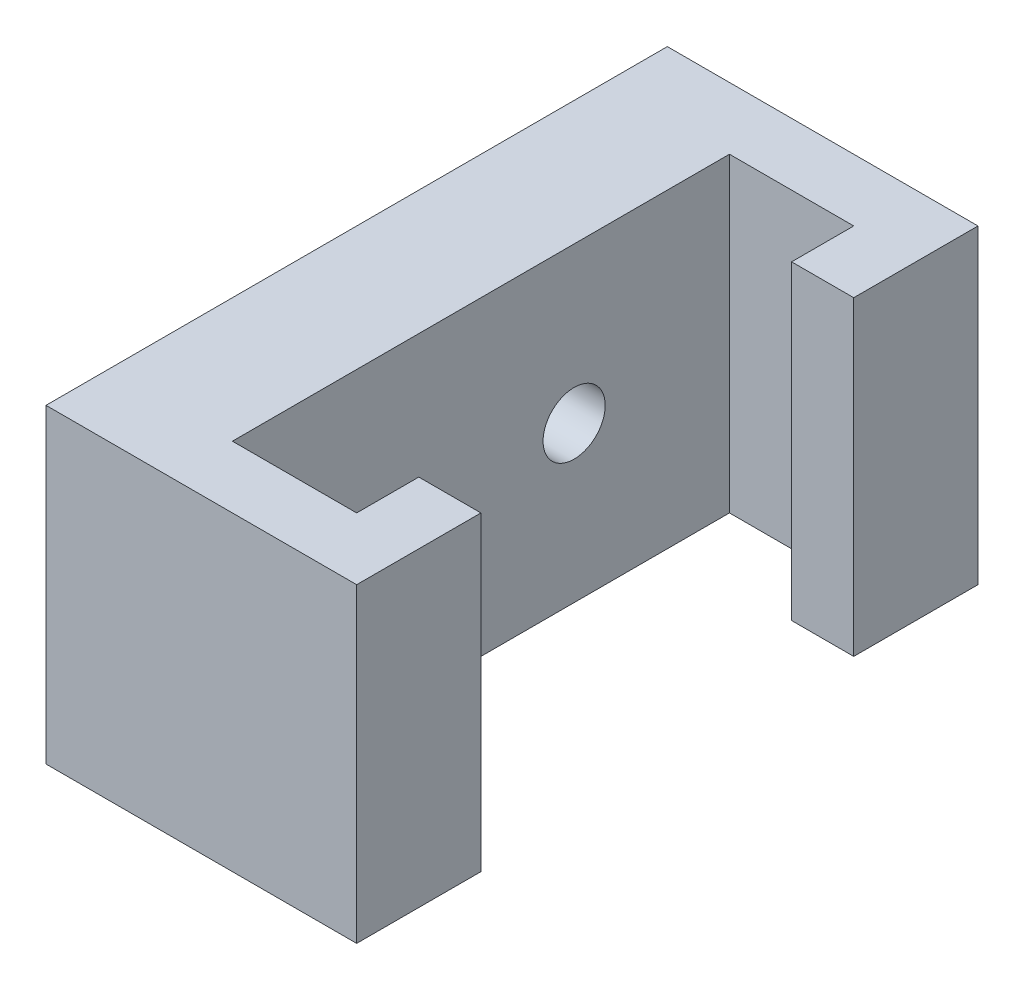
ISO-10303-21;
HEADER;
FILE_DESCRIPTION(('STEP AP214'),'2;1');
FILE_NAME('part.step','',(''),(''),'','','');
FILE_SCHEMA(('AUTOMOTIVE_DESIGN { 1 0 10303 214 1 1 1 1 }'));
ENDSEC;
DATA;
#1=APPLICATION_CONTEXT('core data for automotive mechanical design processes');
#2=APPLICATION_PROTOCOL_DEFINITION('international standard','automotive_design',2000,#1);
#3=PRODUCT_CONTEXT('',#1,'mechanical');
#4=PRODUCT('Part','Part','',(#3));
#5=PRODUCT_RELATED_PRODUCT_CATEGORY('part','',(#4));
#6=PRODUCT_DEFINITION_FORMATION('','',#4);
#7=PRODUCT_DEFINITION_CONTEXT('part definition',#1,'design');
#8=PRODUCT_DEFINITION('design','',#6,#7);
#9=PRODUCT_DEFINITION_SHAPE('','',#8);
#10=(LENGTH_UNIT() NAMED_UNIT(*) SI_UNIT(.MILLI.,.METRE.));
#11=(NAMED_UNIT(*) PLANE_ANGLE_UNIT() SI_UNIT($,.RADIAN.));
#12=(NAMED_UNIT(*) SI_UNIT($,.STERADIAN.) SOLID_ANGLE_UNIT());
#13=UNCERTAINTY_MEASURE_WITH_UNIT(LENGTH_MEASURE(1.E-05),#10,'distance_accuracy_value','');
#14=(GEOMETRIC_REPRESENTATION_CONTEXT(3) GLOBAL_UNCERTAINTY_ASSIGNED_CONTEXT((#13)) GLOBAL_UNIT_ASSIGNED_CONTEXT((#10,
#11,#12)) REPRESENTATION_CONTEXT('',''));
#15=CARTESIAN_POINT('',(0.,0.,0.));
#16=DIRECTION('',(0.,0.,1.));
#17=DIRECTION('',(1.,0.,0.));
#18=AXIS2_PLACEMENT_3D('',#15,#16,#17);
#19=CARTESIAN_POINT('',(150.,35.,0.));
#20=DIRECTION('',(1.,0.,0.));
#21=DIRECTION('',(0.,0.,-1.));
#22=AXIS2_PLACEMENT_3D('',#19,#20,#21);
#23=PLANE('',#22);
#24=DIRECTION('',(0.,0.,-1.));
#25=VECTOR('',#24,1.);
#26=CARTESIAN_POINT('',(150.,60.,0.));
#27=LINE('',#26,#25);
#28=CARTESIAN_POINT('',(150.,60.,9.99999999999999));
#29=VERTEX_POINT('',#28);
#30=CARTESIAN_POINT('',(150.,60.,0.));
#31=VERTEX_POINT('',#30);
#32=EDGE_CURVE('E165',#29,#31,#27,.T.);
#33=ORIENTED_EDGE('',*,*,#32,.F.);
#34=DIRECTION('',(0.,1.,0.));
#35=VECTOR('',#34,1.);
#36=CARTESIAN_POINT('',(150.,35.,9.99999999999999));
#37=LINE('',#36,#35);
#38=CARTESIAN_POINT('',(150.,35.,9.99999999999999));
#39=VERTEX_POINT('',#38);
#40=EDGE_CURVE('E11',#39,#29,#37,.T.);
#41=ORIENTED_EDGE('',*,*,#40,.F.);
#42=DIRECTION('',(0.,0.,-1.));
#43=VECTOR('',#42,1.);
#44=CARTESIAN_POINT('',(150.,35.,0.));
#45=LINE('',#44,#43);
#46=CARTESIAN_POINT('',(150.,35.,0.));
#47=VERTEX_POINT('',#46);
#48=EDGE_CURVE('E198',#39,#47,#45,.T.);
#49=ORIENTED_EDGE('',*,*,#48,.T.);
#50=DIRECTION('',(0.,1.,0.));
#51=VECTOR('',#50,1.);
#52=CARTESIAN_POINT('',(150.,35.,0.));
#53=LINE('',#52,#51);
#54=EDGE_CURVE('E111',#47,#31,#53,.T.);
#55=ORIENTED_EDGE('',*,*,#54,.T.);
#56=EDGE_LOOP('',(#33,#41,#49,#55));
#57=FACE_BOUND('',#56,.T.);
#58=ADVANCED_FACE('F43',(#57),#23,.T.);
#59=CARTESIAN_POINT('',(150.,35.,9.99999999999999));
#60=DIRECTION('',(0.,0.,1.));
#61=DIRECTION('',(1.,0.,0.));
#62=AXIS2_PLACEMENT_3D('',#59,#60,#61);
#63=PLANE('',#62);
#64=DIRECTION('',(1.,0.,0.));
#65=VECTOR('',#64,1.);
#66=CARTESIAN_POINT('',(150.,60.,9.99999999999999));
#67=LINE('',#66,#65);
#68=CARTESIAN_POINT('',(145.,60.,9.99999999999999));
#69=VERTEX_POINT('',#68);
#70=EDGE_CURVE('E196',#69,#29,#67,.T.);
#71=ORIENTED_EDGE('',*,*,#70,.F.);
#72=DIRECTION('',(0.,1.,0.));
#73=VECTOR('',#72,1.);
#74=CARTESIAN_POINT('',(145.,35.,9.99999999999999));
#75=LINE('',#74,#73);
#76=CARTESIAN_POINT('',(145.,35.,9.99999999999999));
#77=VERTEX_POINT('',#76);
#78=EDGE_CURVE('E52',#77,#69,#75,.T.);
#79=ORIENTED_EDGE('',*,*,#78,.F.);
#80=DIRECTION('',(1.,0.,0.));
#81=VECTOR('',#80,1.);
#82=CARTESIAN_POINT('',(150.,35.,9.99999999999999));
#83=LINE('',#82,#81);
#84=EDGE_CURVE('E155',#77,#39,#83,.T.);
#85=ORIENTED_EDGE('',*,*,#84,.T.);
#86=ORIENTED_EDGE('',*,*,#40,.T.);
#87=EDGE_LOOP('',(#71,#79,#85,#86));
#88=FACE_BOUND('',#87,.T.);
#89=ADVANCED_FACE('F287',(#88),#63,.T.);
#90=CARTESIAN_POINT('',(145.,35.,9.99999999999999));
#91=DIRECTION('',(-1.,0.,0.));
#92=DIRECTION('',(0.,0.,1.));
#93=AXIS2_PLACEMENT_3D('',#90,#91,#92);
#94=PLANE('',#93);
#95=DIRECTION('',(0.,0.,1.));
#96=VECTOR('',#95,1.);
#97=CARTESIAN_POINT('',(145.,60.,9.99999999999999));
#98=LINE('',#97,#96);
#99=CARTESIAN_POINT('',(145.,60.,5.));
#100=VERTEX_POINT('',#99);
#101=EDGE_CURVE('E142',#100,#69,#98,.T.);
#102=ORIENTED_EDGE('',*,*,#101,.F.);
#103=DIRECTION('',(0.,1.,0.));
#104=VECTOR('',#103,1.);
#105=CARTESIAN_POINT('',(145.,35.,5.));
#106=LINE('',#105,#104);
#107=CARTESIAN_POINT('',(145.,35.,5.));
#108=VERTEX_POINT('',#107);
#109=EDGE_CURVE('E137',#108,#100,#106,.T.);
#110=ORIENTED_EDGE('',*,*,#109,.F.);
#111=DIRECTION('',(0.,0.,1.));
#112=VECTOR('',#111,1.);
#113=CARTESIAN_POINT('',(145.,35.,9.99999999999999));
#114=LINE('',#113,#112);
#115=EDGE_CURVE('E140',#108,#77,#114,.T.);
#116=ORIENTED_EDGE('',*,*,#115,.T.);
#117=ORIENTED_EDGE('',*,*,#78,.T.);
#118=EDGE_LOOP('',(#102,#110,#116,#117));
#119=FACE_BOUND('',#118,.T.);
#120=ADVANCED_FACE('F139',(#119),#94,.T.);
#121=CARTESIAN_POINT('',(145.,35.,5.));
#122=DIRECTION('',(0.,0.,1.));
#123=DIRECTION('',(1.,0.,0.));
#124=AXIS2_PLACEMENT_3D('',#121,#122,#123);
#125=PLANE('',#124);
#126=DIRECTION('',(1.,0.,0.));
#127=VECTOR('',#126,1.);
#128=CARTESIAN_POINT('',(145.,60.,5.));
#129=LINE('',#128,#127);
#130=CARTESIAN_POINT('',(135.,60.,5.));
#131=VERTEX_POINT('',#130);
#132=EDGE_CURVE('E193',#131,#100,#129,.T.);
#133=ORIENTED_EDGE('',*,*,#132,.F.);
#134=DIRECTION('',(0.,1.,0.));
#135=VECTOR('',#134,1.);
#136=CARTESIAN_POINT('',(135.,35.,5.));
#137=LINE('',#136,#135);
#138=CARTESIAN_POINT('',(135.,35.,5.));
#139=VERTEX_POINT('',#138);
#140=EDGE_CURVE('E147',#139,#131,#137,.T.);
#141=ORIENTED_EDGE('',*,*,#140,.F.);
#142=DIRECTION('',(1.,0.,0.));
#143=VECTOR('',#142,1.);
#144=CARTESIAN_POINT('',(145.,35.,5.));
#145=LINE('',#144,#143);
#146=EDGE_CURVE('E153',#139,#108,#145,.T.);
#147=ORIENTED_EDGE('',*,*,#146,.T.);
#148=ORIENTED_EDGE('',*,*,#109,.T.);
#149=EDGE_LOOP('',(#133,#141,#147,#148));
#150=FACE_BOUND('',#149,.T.);
#151=ADVANCED_FACE('F157',(#150),#125,.T.);
#152=CARTESIAN_POINT('',(135.,35.,5.));
#153=DIRECTION('',(1.,0.,0.));
#154=DIRECTION('',(0.,0.,-1.));
#155=AXIS2_PLACEMENT_3D('',#152,#153,#154);
#156=PLANE('',#155);
#157=CARTESIAN_POINT('',(135.,47.5,32.5));
#158=DIRECTION('',(1.,0.,0.));
#159=DIRECTION('',(0.,0.,-1.));
#160=AXIS2_PLACEMENT_3D('',#157,#158,#159);
#161=CIRCLE('',#160,2.5);
#162=CARTESIAN_POINT('',(135.,47.5,30.));
#163=VERTEX_POINT('',#162);
#164=EDGE_CURVE('E233',#163,#163,#161,.T.);
#165=ORIENTED_EDGE('',*,*,#164,.F.);
#166=EDGE_LOOP('',(#165));
#167=FACE_BOUND('',#166,.T.);
#168=CARTESIAN_POINT('',(135.,47.5,17.5));
#169=DIRECTION('',(1.,0.,0.));
#170=DIRECTION('',(0.,0.,-1.));
#171=AXIS2_PLACEMENT_3D('',#168,#169,#170);
#172=CIRCLE('',#171,2.5);
#173=CARTESIAN_POINT('',(135.,47.5,15.));
#174=VERTEX_POINT('',#173);
#175=EDGE_CURVE('E236',#174,#174,#172,.T.);
#176=ORIENTED_EDGE('',*,*,#175,.F.);
#177=EDGE_LOOP('',(#176));
#178=FACE_BOUND('',#177,.T.);
#179=DIRECTION('',(0.,0.,-1.));
#180=VECTOR('',#179,1.);
#181=CARTESIAN_POINT('',(135.,60.,5.));
#182=LINE('',#181,#180);
#183=CARTESIAN_POINT('',(135.,60.,45.));
#184=VERTEX_POINT('',#183);
#185=EDGE_CURVE('E190',#184,#131,#182,.T.);
#186=ORIENTED_EDGE('',*,*,#185,.F.);
#187=DIRECTION('',(0.,1.,0.));
#188=VECTOR('',#187,1.);
#189=CARTESIAN_POINT('',(135.,35.,45.));
#190=LINE('',#189,#188);
#191=CARTESIAN_POINT('',(135.,35.,45.));
#192=VERTEX_POINT('',#191);
#193=EDGE_CURVE('E202',#192,#184,#190,.T.);
#194=ORIENTED_EDGE('',*,*,#193,.F.);
#195=DIRECTION('',(0.,0.,-1.));
#196=VECTOR('',#195,1.);
#197=CARTESIAN_POINT('',(135.,35.,5.));
#198=LINE('',#197,#196);
#199=EDGE_CURVE('E158',#192,#139,#198,.T.);
#200=ORIENTED_EDGE('',*,*,#199,.T.);
#201=ORIENTED_EDGE('',*,*,#140,.T.);
#202=EDGE_LOOP('',(#186,#194,#200,#201));
#203=FACE_BOUND('',#202,.T.);
#204=ADVANCED_FACE('F301',(#167,#178,#203),#156,.T.);
#205=CARTESIAN_POINT('',(135.,35.,45.));
#206=DIRECTION('',(0.,0.,-1.));
#207=DIRECTION('',(-1.,0.,0.));
#208=AXIS2_PLACEMENT_3D('',#205,#206,#207);
#209=PLANE('',#208);
#210=DIRECTION('',(-1.,0.,0.));
#211=VECTOR('',#210,1.);
#212=CARTESIAN_POINT('',(135.,60.,45.));
#213=LINE('',#212,#211);
#214=CARTESIAN_POINT('',(145.,60.,45.));
#215=VERTEX_POINT('',#214);
#216=EDGE_CURVE('E187',#215,#184,#213,.T.);
#217=ORIENTED_EDGE('',*,*,#216,.F.);
#218=DIRECTION('',(0.,1.,0.));
#219=VECTOR('',#218,1.);
#220=CARTESIAN_POINT('',(145.,35.,45.));
#221=LINE('',#220,#219);
#222=CARTESIAN_POINT('',(145.,35.,45.));
#223=VERTEX_POINT('',#222);
#224=EDGE_CURVE('E204',#223,#215,#221,.T.);
#225=ORIENTED_EDGE('',*,*,#224,.F.);
#226=DIRECTION('',(-1.,0.,0.));
#227=VECTOR('',#226,1.);
#228=CARTESIAN_POINT('',(135.,35.,45.));
#229=LINE('',#228,#227);
#230=EDGE_CURVE('E160',#223,#192,#229,.T.);
#231=ORIENTED_EDGE('',*,*,#230,.T.);
#232=ORIENTED_EDGE('',*,*,#193,.T.);
#233=EDGE_LOOP('',(#217,#225,#231,#232));
#234=FACE_BOUND('',#233,.T.);
#235=ADVANCED_FACE('F262',(#234),#209,.T.);
#236=CARTESIAN_POINT('',(145.,35.,45.));
#237=DIRECTION('',(-1.,0.,0.));
#238=DIRECTION('',(0.,0.,1.));
#239=AXIS2_PLACEMENT_3D('',#236,#237,#238);
#240=PLANE('',#239);
#241=DIRECTION('',(0.,0.,1.));
#242=VECTOR('',#241,1.);
#243=CARTESIAN_POINT('',(145.,60.,45.));
#244=LINE('',#243,#242);
#245=CARTESIAN_POINT('',(145.,60.,40.));
#246=VERTEX_POINT('',#245);
#247=EDGE_CURVE('E184',#246,#215,#244,.T.);
#248=ORIENTED_EDGE('',*,*,#247,.F.);
#249=DIRECTION('',(0.,1.,0.));
#250=VECTOR('',#249,1.);
#251=CARTESIAN_POINT('',(145.,35.,40.));
#252=LINE('',#251,#250);
#253=CARTESIAN_POINT('',(145.,35.,40.));
#254=VERTEX_POINT('',#253);
#255=EDGE_CURVE('E206',#254,#246,#252,.T.);
#256=ORIENTED_EDGE('',*,*,#255,.F.);
#257=DIRECTION('',(0.,0.,1.));
#258=VECTOR('',#257,1.);
#259=CARTESIAN_POINT('',(145.,35.,45.));
#260=LINE('',#259,#258);
#261=EDGE_CURVE('E256',#254,#223,#260,.T.);
#262=ORIENTED_EDGE('',*,*,#261,.T.);
#263=ORIENTED_EDGE('',*,*,#224,.T.);
#264=EDGE_LOOP('',(#248,#256,#262,#263));
#265=FACE_BOUND('',#264,.T.);
#266=ADVANCED_FACE('F268',(#265),#240,.T.);
#267=CARTESIAN_POINT('',(145.,35.,40.));
#268=DIRECTION('',(0.,0.,-1.));
#269=DIRECTION('',(-1.,0.,0.));
#270=AXIS2_PLACEMENT_3D('',#267,#268,#269);
#271=PLANE('',#270);
#272=DIRECTION('',(-1.,0.,0.));
#273=VECTOR('',#272,1.);
#274=CARTESIAN_POINT('',(145.,60.,40.));
#275=LINE('',#274,#273);
#276=CARTESIAN_POINT('',(150.,60.,40.));
#277=VERTEX_POINT('',#276);
#278=EDGE_CURVE('E181',#277,#246,#275,.T.);
#279=ORIENTED_EDGE('',*,*,#278,.F.);
#280=DIRECTION('',(0.,1.,0.));
#281=VECTOR('',#280,1.);
#282=CARTESIAN_POINT('',(150.,35.,40.));
#283=LINE('',#282,#281);
#284=CARTESIAN_POINT('',(150.,35.,40.));
#285=VERTEX_POINT('',#284);
#286=EDGE_CURVE('E208',#285,#277,#283,.T.);
#287=ORIENTED_EDGE('',*,*,#286,.F.);
#288=DIRECTION('',(-1.,0.,0.));
#289=VECTOR('',#288,1.);
#290=CARTESIAN_POINT('',(145.,35.,40.));
#291=LINE('',#290,#289);
#292=EDGE_CURVE('E253',#285,#254,#291,.T.);
#293=ORIENTED_EDGE('',*,*,#292,.T.);
#294=ORIENTED_EDGE('',*,*,#255,.T.);
#295=EDGE_LOOP('',(#279,#287,#293,#294));
#296=FACE_BOUND('',#295,.T.);
#297=ADVANCED_FACE('F271',(#296),#271,.T.);
#298=CARTESIAN_POINT('',(150.,35.,40.));
#299=DIRECTION('',(1.,0.,0.));
#300=DIRECTION('',(0.,0.,-1.));
#301=AXIS2_PLACEMENT_3D('',#298,#299,#300);
#302=PLANE('',#301);
#303=DIRECTION('',(0.,0.,-1.));
#304=VECTOR('',#303,1.);
#305=CARTESIAN_POINT('',(150.,60.,40.));
#306=LINE('',#305,#304);
#307=CARTESIAN_POINT('',(150.,60.,50.));
#308=VERTEX_POINT('',#307);
#309=EDGE_CURVE('E178',#308,#277,#306,.T.);
#310=ORIENTED_EDGE('',*,*,#309,.F.);
#311=DIRECTION('',(0.,1.,0.));
#312=VECTOR('',#311,1.);
#313=CARTESIAN_POINT('',(150.,35.,50.));
#314=LINE('',#313,#312);
#315=CARTESIAN_POINT('',(150.,35.,50.));
#316=VERTEX_POINT('',#315);
#317=EDGE_CURVE('E210',#316,#308,#314,.T.);
#318=ORIENTED_EDGE('',*,*,#317,.F.);
#319=DIRECTION('',(0.,0.,-1.));
#320=VECTOR('',#319,1.);
#321=CARTESIAN_POINT('',(150.,35.,40.));
#322=LINE('',#321,#320);
#323=EDGE_CURVE('E250',#316,#285,#322,.T.);
#324=ORIENTED_EDGE('',*,*,#323,.T.);
#325=ORIENTED_EDGE('',*,*,#286,.T.);
#326=EDGE_LOOP('',(#310,#318,#324,#325));
#327=FACE_BOUND('',#326,.T.);
#328=ADVANCED_FACE('F276',(#327),#302,.T.);
#329=CARTESIAN_POINT('',(150.,35.,50.));
#330=DIRECTION('',(0.,0.,1.));
#331=DIRECTION('',(1.,0.,0.));
#332=AXIS2_PLACEMENT_3D('',#329,#330,#331);
#333=PLANE('',#332);
#334=DIRECTION('',(1.,0.,0.));
#335=VECTOR('',#334,1.);
#336=CARTESIAN_POINT('',(150.,60.,50.));
#337=LINE('',#336,#335);
#338=CARTESIAN_POINT('',(125.,60.,50.));
#339=VERTEX_POINT('',#338);
#340=EDGE_CURVE('E175',#339,#308,#337,.T.);
#341=ORIENTED_EDGE('',*,*,#340,.F.);
#342=DIRECTION('',(0.,1.,0.));
#343=VECTOR('',#342,1.);
#344=CARTESIAN_POINT('',(125.,35.,50.));
#345=LINE('',#344,#343);
#346=CARTESIAN_POINT('',(125.,35.,50.));
#347=VERTEX_POINT('',#346);
#348=EDGE_CURVE('E212',#347,#339,#345,.T.);
#349=ORIENTED_EDGE('',*,*,#348,.F.);
#350=DIRECTION('',(1.,0.,0.));
#351=VECTOR('',#350,1.);
#352=CARTESIAN_POINT('',(150.,35.,50.));
#353=LINE('',#352,#351);
#354=EDGE_CURVE('E247',#347,#316,#353,.T.);
#355=ORIENTED_EDGE('',*,*,#354,.T.);
#356=ORIENTED_EDGE('',*,*,#317,.T.);
#357=EDGE_LOOP('',(#341,#349,#355,#356));
#358=FACE_BOUND('',#357,.T.);
#359=ADVANCED_FACE('F279',(#358),#333,.T.);
#360=CARTESIAN_POINT('',(125.,35.,50.));
#361=DIRECTION('',(-1.,0.,0.));
#362=DIRECTION('',(0.,0.,1.));
#363=AXIS2_PLACEMENT_3D('',#360,#361,#362);
#364=PLANE('',#363);
#365=CARTESIAN_POINT('',(125.,47.5,17.5));
#366=DIRECTION('',(-1.,0.,0.));
#367=DIRECTION('',(0.,0.,1.));
#368=AXIS2_PLACEMENT_3D('',#365,#366,#367);
#369=CIRCLE('',#368,1.75);
#370=CARTESIAN_POINT('',(125.,47.5,19.25));
#371=VERTEX_POINT('',#370);
#372=EDGE_CURVE('E46',#371,#371,#369,.T.);
#373=ORIENTED_EDGE('',*,*,#372,.F.);
#374=EDGE_LOOP('',(#373));
#375=FACE_BOUND('',#374,.T.);
#376=CARTESIAN_POINT('',(125.,47.5,32.5));
#377=DIRECTION('',(-1.,0.,0.));
#378=DIRECTION('',(0.,0.,1.));
#379=AXIS2_PLACEMENT_3D('',#376,#377,#378);
#380=CIRCLE('',#379,1.75);
#381=CARTESIAN_POINT('',(125.,47.5,34.25));
#382=VERTEX_POINT('',#381);
#383=EDGE_CURVE('E216',#382,#382,#380,.T.);
#384=ORIENTED_EDGE('',*,*,#383,.F.);
#385=EDGE_LOOP('',(#384));
#386=FACE_BOUND('',#385,.T.);
#387=DIRECTION('',(0.,0.,1.));
#388=VECTOR('',#387,1.);
#389=CARTESIAN_POINT('',(125.,60.,50.));
#390=LINE('',#389,#388);
#391=CARTESIAN_POINT('',(125.,60.,0.));
#392=VERTEX_POINT('',#391);
#393=EDGE_CURVE('E172',#392,#339,#390,.T.);
#394=ORIENTED_EDGE('',*,*,#393,.F.);
#395=DIRECTION('',(0.,1.,0.));
#396=VECTOR('',#395,1.);
#397=CARTESIAN_POINT('',(125.,35.,0.));
#398=LINE('',#397,#396);
#399=CARTESIAN_POINT('',(125.,35.,0.));
#400=VERTEX_POINT('',#399);
#401=EDGE_CURVE('E214',#400,#392,#398,.T.);
#402=ORIENTED_EDGE('',*,*,#401,.F.);
#403=DIRECTION('',(0.,0.,1.));
#404=VECTOR('',#403,1.);
#405=CARTESIAN_POINT('',(125.,35.,50.));
#406=LINE('',#405,#404);
#407=EDGE_CURVE('E244',#400,#347,#406,.T.);
#408=ORIENTED_EDGE('',*,*,#407,.T.);
#409=ORIENTED_EDGE('',*,*,#348,.T.);
#410=EDGE_LOOP('',(#394,#402,#408,#409));
#411=FACE_BOUND('',#410,.T.);
#412=ADVANCED_FACE('F283',(#375,#386,#411),#364,.T.);
#413=CARTESIAN_POINT('',(125.,35.,0.));
#414=DIRECTION('',(0.,0.,-1.));
#415=DIRECTION('',(-1.,0.,0.));
#416=AXIS2_PLACEMENT_3D('',#413,#414,#415);
#417=PLANE('',#416);
#418=DIRECTION('',(-1.,0.,0.));
#419=VECTOR('',#418,1.);
#420=CARTESIAN_POINT('',(125.,60.,0.));
#421=LINE('',#420,#419);
#422=EDGE_CURVE('E168',#31,#392,#421,.T.);
#423=ORIENTED_EDGE('',*,*,#422,.F.);
#424=ORIENTED_EDGE('',*,*,#54,.F.);
#425=DIRECTION('',(-1.,0.,0.));
#426=VECTOR('',#425,1.);
#427=CARTESIAN_POINT('',(125.,35.,0.));
#428=LINE('',#427,#426);
#429=EDGE_CURVE('E242',#47,#400,#428,.T.);
#430=ORIENTED_EDGE('',*,*,#429,.T.);
#431=ORIENTED_EDGE('',*,*,#401,.T.);
#432=EDGE_LOOP('',(#423,#424,#430,#431));
#433=FACE_BOUND('',#432,.T.);
#434=ADVANCED_FACE('F284',(#433),#417,.T.);
#435=CARTESIAN_POINT('',(0.,35.,0.));
#436=DIRECTION('',(0.,-1.,0.));
#437=DIRECTION('',(0.,0.,-1.));
#438=AXIS2_PLACEMENT_3D('',#435,#436,#437);
#439=PLANE('',#438);
#440=ORIENTED_EDGE('',*,*,#48,.F.);
#441=ORIENTED_EDGE('',*,*,#84,.F.);
#442=ORIENTED_EDGE('',*,*,#115,.F.);
#443=ORIENTED_EDGE('',*,*,#146,.F.);
#444=ORIENTED_EDGE('',*,*,#199,.F.);
#445=ORIENTED_EDGE('',*,*,#230,.F.);
#446=ORIENTED_EDGE('',*,*,#261,.F.);
#447=ORIENTED_EDGE('',*,*,#292,.F.);
#448=ORIENTED_EDGE('',*,*,#323,.F.);
#449=ORIENTED_EDGE('',*,*,#354,.F.);
#450=ORIENTED_EDGE('',*,*,#407,.F.);
#451=ORIENTED_EDGE('',*,*,#429,.F.);
#452=EDGE_LOOP('',(#440,#441,#442,#443,#444,#445,#446,#447,#448,#449,#450,#451));
#453=FACE_BOUND('',#452,.T.);
#454=ADVANCED_FACE('F151',(#453),#439,.T.);
#455=CARTESIAN_POINT('',(0.,60.,0.));
#456=DIRECTION('',(0.,-1.,0.));
#457=DIRECTION('',(0.,0.,-1.));
#458=AXIS2_PLACEMENT_3D('',#455,#456,#457);
#459=PLANE('',#458);
#460=ORIENTED_EDGE('',*,*,#32,.T.);
#461=ORIENTED_EDGE('',*,*,#422,.T.);
#462=ORIENTED_EDGE('',*,*,#393,.T.);
#463=ORIENTED_EDGE('',*,*,#340,.T.);
#464=ORIENTED_EDGE('',*,*,#309,.T.);
#465=ORIENTED_EDGE('',*,*,#278,.T.);
#466=ORIENTED_EDGE('',*,*,#247,.T.);
#467=ORIENTED_EDGE('',*,*,#216,.T.);
#468=ORIENTED_EDGE('',*,*,#185,.T.);
#469=ORIENTED_EDGE('',*,*,#132,.T.);
#470=ORIENTED_EDGE('',*,*,#101,.T.);
#471=ORIENTED_EDGE('',*,*,#70,.T.);
#472=EDGE_LOOP('',(#460,#461,#462,#463,#464,#465,#466,#467,#468,#469,#470,#471));
#473=FACE_BOUND('',#472,.T.);
#474=ADVANCED_FACE('F286',(#473),#459,.F.);
#475=CARTESIAN_POINT('',(130.,47.5,17.5));
#476=DIRECTION('',(1.,0.,0.));
#477=DIRECTION('',(0.,0.,-1.));
#478=AXIS2_PLACEMENT_3D('',#475,#476,#477);
#479=CYLINDRICAL_SURFACE('',#478,2.5);
#480=CARTESIAN_POINT('',(130.,47.5,17.5));
#481=DIRECTION('',(1.,0.,0.));
#482=DIRECTION('',(0.,0.,-1.));
#483=AXIS2_PLACEMENT_3D('',#480,#481,#482);
#484=CIRCLE('',#483,2.5);
#485=CARTESIAN_POINT('',(130.,47.5,15.));
#486=VERTEX_POINT('',#485);
#487=EDGE_CURVE('E222',#486,#486,#484,.T.);
#488=ORIENTED_EDGE('',*,*,#487,.F.);
#489=EDGE_LOOP('',(#488));
#490=FACE_BOUND('',#489,.T.);
#491=ORIENTED_EDGE('',*,*,#175,.T.);
#492=EDGE_LOOP('',(#491));
#493=FACE_BOUND('',#492,.T.);
#494=ADVANCED_FACE('F326',(#490,#493),#479,.F.);
#495=CARTESIAN_POINT('',(130.,47.5,17.5));
#496=DIRECTION('',(1.,0.,0.));
#497=DIRECTION('',(0.,0.,-1.));
#498=AXIS2_PLACEMENT_3D('',#495,#496,#497);
#499=PLANE('',#498);
#500=CARTESIAN_POINT('',(130.,47.5,17.5));
#501=DIRECTION('',(1.,0.,0.));
#502=DIRECTION('',(0.,0.,-1.));
#503=AXIS2_PLACEMENT_3D('',#500,#501,#502);
#504=CIRCLE('',#503,1.75);
#505=CARTESIAN_POINT('',(130.,47.5,15.75));
#506=VERTEX_POINT('',#505);
#507=EDGE_CURVE('E218',#506,#506,#504,.T.);
#508=ORIENTED_EDGE('',*,*,#507,.F.);
#509=EDGE_LOOP('',(#508));
#510=FACE_BOUND('',#509,.T.);
#511=ORIENTED_EDGE('',*,*,#487,.T.);
#512=EDGE_LOOP('',(#511));
#513=FACE_BOUND('',#512,.T.);
#514=ADVANCED_FACE('F328',(#510,#513),#499,.T.);
#515=CARTESIAN_POINT('',(130.,47.5,32.5));
#516=DIRECTION('',(1.,0.,0.));
#517=DIRECTION('',(0.,0.,-1.));
#518=AXIS2_PLACEMENT_3D('',#515,#516,#517);
#519=CYLINDRICAL_SURFACE('',#518,2.5);
#520=CARTESIAN_POINT('',(130.,47.5,32.5));
#521=DIRECTION('',(1.,0.,0.));
#522=DIRECTION('',(0.,0.,-1.));
#523=AXIS2_PLACEMENT_3D('',#520,#521,#522);
#524=CIRCLE('',#523,2.5);
#525=CARTESIAN_POINT('',(130.,47.5,30.));
#526=VERTEX_POINT('',#525);
#527=EDGE_CURVE('E169',#526,#526,#524,.T.);
#528=ORIENTED_EDGE('',*,*,#527,.F.);
#529=EDGE_LOOP('',(#528));
#530=FACE_BOUND('',#529,.T.);
#531=ORIENTED_EDGE('',*,*,#164,.T.);
#532=EDGE_LOOP('',(#531));
#533=FACE_BOUND('',#532,.T.);
#534=ADVANCED_FACE('F331',(#530,#533),#519,.F.);
#535=CARTESIAN_POINT('',(130.,47.5,32.5));
#536=DIRECTION('',(1.,0.,0.));
#537=DIRECTION('',(0.,0.,-1.));
#538=AXIS2_PLACEMENT_3D('',#535,#536,#537);
#539=PLANE('',#538);
#540=CARTESIAN_POINT('',(130.,47.5,32.5));
#541=DIRECTION('',(1.,0.,0.));
#542=DIRECTION('',(0.,0.,-1.));
#543=AXIS2_PLACEMENT_3D('',#540,#541,#542);
#544=CIRCLE('',#543,1.75);
#545=CARTESIAN_POINT('',(130.,47.5,30.75));
#546=VERTEX_POINT('',#545);
#547=EDGE_CURVE('E224',#546,#546,#544,.T.);
#548=ORIENTED_EDGE('',*,*,#547,.F.);
#549=EDGE_LOOP('',(#548));
#550=FACE_BOUND('',#549,.T.);
#551=ORIENTED_EDGE('',*,*,#527,.T.);
#552=EDGE_LOOP('',(#551));
#553=FACE_BOUND('',#552,.T.);
#554=ADVANCED_FACE('F338',(#550,#553),#539,.T.);
#555=CARTESIAN_POINT('',(119.,47.5,32.5));
#556=DIRECTION('',(1.,0.,0.));
#557=DIRECTION('',(0.,0.,-1.));
#558=AXIS2_PLACEMENT_3D('',#555,#556,#557);
#559=CYLINDRICAL_SURFACE('',#558,1.75);
#560=ORIENTED_EDGE('',*,*,#383,.T.);
#561=EDGE_LOOP('',(#560));
#562=FACE_BOUND('',#561,.T.);
#563=ORIENTED_EDGE('',*,*,#547,.T.);
#564=EDGE_LOOP('',(#563));
#565=FACE_BOUND('',#564,.T.);
#566=ADVANCED_FACE('F342',(#562,#565),#559,.F.);
#567=CARTESIAN_POINT('',(119.,47.5,17.5));
#568=DIRECTION('',(1.,0.,0.));
#569=DIRECTION('',(0.,0.,-1.));
#570=AXIS2_PLACEMENT_3D('',#567,#568,#569);
#571=CYLINDRICAL_SURFACE('',#570,1.75);
#572=ORIENTED_EDGE('',*,*,#372,.T.);
#573=EDGE_LOOP('',(#572));
#574=FACE_BOUND('',#573,.T.);
#575=ORIENTED_EDGE('',*,*,#507,.T.);
#576=EDGE_LOOP('',(#575));
#577=FACE_BOUND('',#576,.T.);
#578=ADVANCED_FACE('F346',(#574,#577),#571,.F.);
#579=CLOSED_SHELL('',(#58,#89,#120,#151,#204,#235,#266,#297,#328,#359,#412,#434,#454,#474,#494,
#514,#534,#554,#566,#578));
#580=MANIFOLD_SOLID_BREP('B2',#579);
#581=ADVANCED_BREP_SHAPE_REPRESENTATION('',(#18,#580),#14);
#582=SHAPE_DEFINITION_REPRESENTATION(#9,#581);
ENDSEC;
END-ISO-10303-21;
